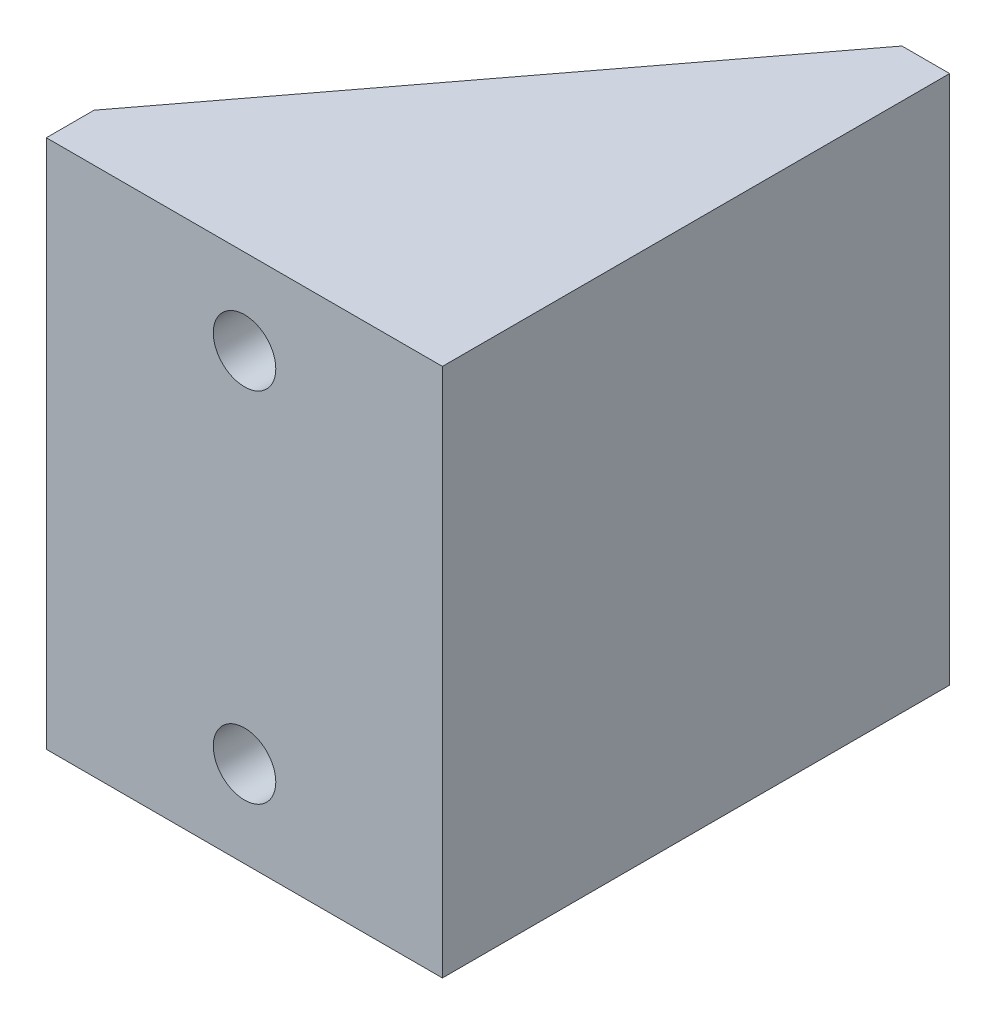
ISO-10303-21;
HEADER;
FILE_DESCRIPTION(('STEP AP214'),'2;1');
FILE_NAME('part.step','',(''),(''),'','','');
FILE_SCHEMA(('AUTOMOTIVE_DESIGN { 1 0 10303 214 1 1 1 1 }'));
ENDSEC;
DATA;
#1=APPLICATION_CONTEXT('core data for automotive mechanical design processes');
#2=APPLICATION_PROTOCOL_DEFINITION('international standard','automotive_design',2000,#1);
#3=PRODUCT_CONTEXT('',#1,'mechanical');
#4=PRODUCT('Part','Part','',(#3));
#5=PRODUCT_RELATED_PRODUCT_CATEGORY('part','',(#4));
#6=PRODUCT_DEFINITION_FORMATION('','',#4);
#7=PRODUCT_DEFINITION_CONTEXT('part definition',#1,'design');
#8=PRODUCT_DEFINITION('design','',#6,#7);
#9=PRODUCT_DEFINITION_SHAPE('','',#8);
#10=(LENGTH_UNIT() NAMED_UNIT(*) SI_UNIT(.MILLI.,.METRE.));
#11=(NAMED_UNIT(*) PLANE_ANGLE_UNIT() SI_UNIT($,.RADIAN.));
#12=(NAMED_UNIT(*) SI_UNIT($,.STERADIAN.) SOLID_ANGLE_UNIT());
#13=UNCERTAINTY_MEASURE_WITH_UNIT(LENGTH_MEASURE(1.E-05),#10,'distance_accuracy_value','');
#14=(GEOMETRIC_REPRESENTATION_CONTEXT(3) GLOBAL_UNCERTAINTY_ASSIGNED_CONTEXT((#13)) GLOBAL_UNIT_ASSIGNED_CONTEXT((#10,
#11,#12)) REPRESENTATION_CONTEXT('',''));
#15=CARTESIAN_POINT('',(0.,0.,0.));
#16=DIRECTION('',(0.,0.,1.));
#17=DIRECTION('',(1.,0.,0.));
#18=AXIS2_PLACEMENT_3D('',#15,#16,#17);
#19=CARTESIAN_POINT('',(21.082,-28.194,5.08));
#20=DIRECTION('',(-1.,0.,0.));
#21=DIRECTION('',(0.,0.,1.));
#22=AXIS2_PLACEMENT_3D('',#19,#20,#21);
#23=PLANE('',#22);
#24=DIRECTION('',(0.,0.,-1.));
#25=VECTOR('',#24,1.);
#26=CARTESIAN_POINT('',(21.082,-28.194,5.08));
#27=LINE('',#26,#25);
#28=CARTESIAN_POINT('',(21.082,-28.194,5.08));
#29=VERTEX_POINT('',#28);
#30=CARTESIAN_POINT('',(21.082,-28.194,-48.92));
#31=VERTEX_POINT('',#30);
#32=EDGE_CURVE('E167',#29,#31,#27,.T.);
#33=ORIENTED_EDGE('',*,*,#32,.T.);
#34=DIRECTION('',(0.,1.,0.));
#35=VECTOR('',#34,1.);
#36=CARTESIAN_POINT('',(21.082,-28.194,-48.92));
#37=LINE('',#36,#35);
#38=CARTESIAN_POINT('',(21.082,28.194,-48.92));
#39=VERTEX_POINT('',#38);
#40=EDGE_CURVE('E147',#31,#39,#37,.T.);
#41=ORIENTED_EDGE('',*,*,#40,.T.);
#42=DIRECTION('',(0.,0.,-1.));
#43=VECTOR('',#42,1.);
#44=CARTESIAN_POINT('',(21.082,28.194,5.08));
#45=LINE('',#44,#43);
#46=CARTESIAN_POINT('',(21.082,28.194,5.08));
#47=VERTEX_POINT('',#46);
#48=EDGE_CURVE('E39',#47,#39,#45,.T.);
#49=ORIENTED_EDGE('',*,*,#48,.F.);
#50=DIRECTION('',(0.,1.,0.));
#51=VECTOR('',#50,1.);
#52=CARTESIAN_POINT('',(21.082,-28.194,5.08));
#53=LINE('',#52,#51);
#54=EDGE_CURVE('E160',#29,#47,#53,.T.);
#55=ORIENTED_EDGE('',*,*,#54,.F.);
#56=EDGE_LOOP('',(#33,#41,#49,#55));
#57=FACE_BOUND('',#56,.T.);
#58=ADVANCED_FACE('F32',(#57),#23,.F.);
#59=CARTESIAN_POINT('',(-21.082,28.194,5.08));
#60=DIRECTION('',(0.,-1.,0.));
#61=DIRECTION('',(0.,0.,-1.));
#62=AXIS2_PLACEMENT_3D('',#59,#60,#61);
#63=PLANE('',#62);
#64=DIRECTION('',(-0.604099786752198,0.,0.79690868212484));
#65=VECTOR('',#64,1.);
#66=CARTESIAN_POINT('',(16.002,28.194,-48.92));
#67=LINE('',#66,#65);
#68=CARTESIAN_POINT('',(16.002,28.194,-48.92));
#69=VERTEX_POINT('',#68);
#70=CARTESIAN_POINT('',(-21.082,28.194,0.));
#71=VERTEX_POINT('',#70);
#72=EDGE_CURVE('E134',#69,#71,#67,.T.);
#73=ORIENTED_EDGE('',*,*,#72,.T.);
#74=DIRECTION('',(0.,0.,-1.));
#75=VECTOR('',#74,1.);
#76=CARTESIAN_POINT('',(-21.082,28.194,5.08));
#77=LINE('',#76,#75);
#78=CARTESIAN_POINT('',(-21.082,28.194,5.08));
#79=VERTEX_POINT('',#78);
#80=EDGE_CURVE('E173',#79,#71,#77,.T.);
#81=ORIENTED_EDGE('',*,*,#80,.F.);
#82=DIRECTION('',(-1.,0.,0.));
#83=VECTOR('',#82,1.);
#84=CARTESIAN_POINT('',(-21.082,28.194,5.08));
#85=LINE('',#84,#83);
#86=EDGE_CURVE('E162',#47,#79,#85,.T.);
#87=ORIENTED_EDGE('',*,*,#86,.F.);
#88=ORIENTED_EDGE('',*,*,#48,.T.);
#89=DIRECTION('',(1.,0.,0.));
#90=VECTOR('',#89,1.);
#91=CARTESIAN_POINT('',(16.002,28.194,-48.92));
#92=LINE('',#91,#90);
#93=EDGE_CURVE('E155',#69,#39,#92,.T.);
#94=ORIENTED_EDGE('',*,*,#93,.F.);
#95=EDGE_LOOP('',(#73,#81,#87,#88,#94));
#96=FACE_BOUND('',#95,.T.);
#97=ADVANCED_FACE('F178',(#96),#63,.F.);
#98=CARTESIAN_POINT('',(-21.082,-28.194,5.08));
#99=DIRECTION('',(1.,0.,0.));
#100=DIRECTION('',(0.,0.,-1.));
#101=AXIS2_PLACEMENT_3D('',#98,#99,#100);
#102=PLANE('',#101);
#103=DIRECTION('',(0.,-1.,0.));
#104=VECTOR('',#103,1.);
#105=CARTESIAN_POINT('',(-21.082,-28.194,0.));
#106=LINE('',#105,#104);
#107=CARTESIAN_POINT('',(-21.082,23.114,0.));
#108=VERTEX_POINT('',#107);
#109=EDGE_CURVE('E163',#71,#108,#106,.T.);
#110=ORIENTED_EDGE('',*,*,#109,.T.);
#111=CARTESIAN_POINT('',(-21.082,-23.114,0.));
#112=VERTEX_POINT('',#111);
#113=EDGE_CURVE('E120',#108,#112,#106,.T.);
#114=ORIENTED_EDGE('',*,*,#113,.T.);
#115=DIRECTION('',(0.,-1.,0.));
#116=VECTOR('',#115,1.);
#117=CARTESIAN_POINT('',(-21.082,-23.114,0.));
#118=LINE('',#117,#116);
#119=CARTESIAN_POINT('',(-21.082,-28.194,0.));
#120=VERTEX_POINT('',#119);
#121=EDGE_CURVE('E136',#112,#120,#118,.T.);
#122=ORIENTED_EDGE('',*,*,#121,.T.);
#123=DIRECTION('',(0.,0.,-1.));
#124=VECTOR('',#123,1.);
#125=CARTESIAN_POINT('',(-21.082,-28.194,5.08));
#126=LINE('',#125,#124);
#127=CARTESIAN_POINT('',(-21.082,-28.194,5.08));
#128=VERTEX_POINT('',#127);
#129=EDGE_CURVE('E170',#128,#120,#126,.T.);
#130=ORIENTED_EDGE('',*,*,#129,.F.);
#131=DIRECTION('',(0.,-1.,0.));
#132=VECTOR('',#131,1.);
#133=CARTESIAN_POINT('',(-21.082,-28.194,5.08));
#134=LINE('',#133,#132);
#135=EDGE_CURVE('E51',#79,#128,#134,.T.);
#136=ORIENTED_EDGE('',*,*,#135,.F.);
#137=ORIENTED_EDGE('',*,*,#80,.T.);
#138=EDGE_LOOP('',(#110,#114,#122,#130,#136,#137));
#139=FACE_BOUND('',#138,.T.);
#140=ADVANCED_FACE('F200',(#139),#102,.F.);
#141=CARTESIAN_POINT('',(-21.082,-28.194,5.08));
#142=DIRECTION('',(0.,1.,0.));
#143=DIRECTION('',(0.,0.,1.));
#144=AXIS2_PLACEMENT_3D('',#141,#142,#143);
#145=PLANE('',#144);
#146=ORIENTED_EDGE('',*,*,#129,.T.);
#147=DIRECTION('',(-0.604099786752198,0.,0.79690868212484));
#148=VECTOR('',#147,1.);
#149=CARTESIAN_POINT('',(16.002,-28.194,-48.92));
#150=LINE('',#149,#148);
#151=CARTESIAN_POINT('',(16.002,-28.194,-48.92));
#152=VERTEX_POINT('',#151);
#153=EDGE_CURVE('E113',#152,#120,#150,.T.);
#154=ORIENTED_EDGE('',*,*,#153,.F.);
#155=DIRECTION('',(1.,0.,0.));
#156=VECTOR('',#155,1.);
#157=CARTESIAN_POINT('',(16.002,-28.194,-48.92));
#158=LINE('',#157,#156);
#159=EDGE_CURVE('E152',#152,#31,#158,.T.);
#160=ORIENTED_EDGE('',*,*,#159,.T.);
#161=ORIENTED_EDGE('',*,*,#32,.F.);
#162=DIRECTION('',(1.,0.,0.));
#163=VECTOR('',#162,1.);
#164=CARTESIAN_POINT('',(-21.082,-28.194,5.08));
#165=LINE('',#164,#163);
#166=EDGE_CURVE('E46',#128,#29,#165,.T.);
#167=ORIENTED_EDGE('',*,*,#166,.F.);
#168=EDGE_LOOP('',(#146,#154,#160,#161,#167));
#169=FACE_BOUND('',#168,.T.);
#170=ADVANCED_FACE('F189',(#169),#145,.F.);
#171=CARTESIAN_POINT('',(0.,0.,5.08));
#172=DIRECTION('',(0.,0.,-1.));
#173=DIRECTION('',(-1.,0.,0.));
#174=AXIS2_PLACEMENT_3D('',#171,#172,#173);
#175=PLANE('',#174);
#176=CARTESIAN_POINT('',(0.0164035310449839,-18.9970964149552,5.08));
#177=DIRECTION('',(0.,0.,1.));
#178=DIRECTION('',(1.,0.,0.));
#179=AXIS2_PLACEMENT_3D('',#176,#177,#178);
#180=CIRCLE('',#179,3.3274);
#181=CARTESIAN_POINT('',(3.34380353104499,-18.9970964149552,5.08));
#182=VERTEX_POINT('',#181);
#183=EDGE_CURVE('E128',#182,#182,#180,.T.);
#184=ORIENTED_EDGE('',*,*,#183,.F.);
#185=EDGE_LOOP('',(#184));
#186=FACE_BOUND('',#185,.T.);
#187=CARTESIAN_POINT('',(0.0164035310449284,19.1029035850448,5.08));
#188=DIRECTION('',(0.,0.,1.));
#189=DIRECTION('',(1.,0.,0.));
#190=AXIS2_PLACEMENT_3D('',#187,#188,#189);
#191=CIRCLE('',#190,3.3274);
#192=CARTESIAN_POINT('',(3.34380353104493,19.1029035850448,5.08));
#193=VERTEX_POINT('',#192);
#194=EDGE_CURVE('E141',#193,#193,#191,.T.);
#195=ORIENTED_EDGE('',*,*,#194,.F.);
#196=EDGE_LOOP('',(#195));
#197=FACE_BOUND('',#196,.T.);
#198=ORIENTED_EDGE('',*,*,#166,.T.);
#199=ORIENTED_EDGE('',*,*,#54,.T.);
#200=ORIENTED_EDGE('',*,*,#86,.T.);
#201=ORIENTED_EDGE('',*,*,#135,.T.);
#202=EDGE_LOOP('',(#198,#199,#200,#201));
#203=FACE_BOUND('',#202,.T.);
#204=ADVANCED_FACE('F207',(#186,#197,#203),#175,.F.);
#205=CARTESIAN_POINT('',(0.,0.,0.));
#206=DIRECTION('',(0.,0.,-1.));
#207=DIRECTION('',(-1.,0.,0.));
#208=AXIS2_PLACEMENT_3D('',#205,#206,#207);
#209=PLANE('',#208);
#210=DIRECTION('',(1.,0.,0.));
#211=VECTOR('',#210,1.);
#212=CARTESIAN_POINT('',(16.002,-23.114,0.));
#213=LINE('',#212,#211);
#214=CARTESIAN_POINT('',(16.002,-23.114,0.));
#215=VERTEX_POINT('',#214);
#216=EDGE_CURVE('E95',#112,#215,#213,.T.);
#217=ORIENTED_EDGE('',*,*,#216,.F.);
#218=ORIENTED_EDGE('',*,*,#113,.F.);
#219=DIRECTION('',(1.,0.,0.));
#220=VECTOR('',#219,1.);
#221=CARTESIAN_POINT('',(16.002,23.114,0.));
#222=LINE('',#221,#220);
#223=CARTESIAN_POINT('',(16.002,23.114,0.));
#224=VERTEX_POINT('',#223);
#225=EDGE_CURVE('E119',#108,#224,#222,.T.);
#226=ORIENTED_EDGE('',*,*,#225,.T.);
#227=DIRECTION('',(0.,1.,0.));
#228=VECTOR('',#227,1.);
#229=CARTESIAN_POINT('',(16.002,0.,0.));
#230=LINE('',#229,#228);
#231=EDGE_CURVE('E11',#215,#224,#230,.T.);
#232=ORIENTED_EDGE('',*,*,#231,.F.);
#233=EDGE_LOOP('',(#217,#218,#226,#232));
#234=FACE_BOUND('',#233,.T.);
#235=CARTESIAN_POINT('',(0.0164035310449839,-18.9970964149552,0.));
#236=DIRECTION('',(0.,0.,1.));
#237=DIRECTION('',(1.,0.,0.));
#238=AXIS2_PLACEMENT_3D('',#235,#236,#237);
#239=CIRCLE('',#238,3.3274);
#240=CARTESIAN_POINT('',(3.34380353104499,-18.9970964149552,0.));
#241=VERTEX_POINT('',#240);
#242=EDGE_CURVE('E138',#241,#241,#239,.T.);
#243=ORIENTED_EDGE('',*,*,#242,.T.);
#244=EDGE_LOOP('',(#243));
#245=FACE_BOUND('',#244,.T.);
#246=CARTESIAN_POINT('',(0.0164035310449284,19.1029035850448,0.));
#247=DIRECTION('',(0.,0.,1.));
#248=DIRECTION('',(1.,0.,0.));
#249=AXIS2_PLACEMENT_3D('',#246,#247,#248);
#250=CIRCLE('',#249,3.3274);
#251=CARTESIAN_POINT('',(3.34380353104493,19.1029035850448,0.));
#252=VERTEX_POINT('',#251);
#253=EDGE_CURVE('E144',#252,#252,#250,.T.);
#254=ORIENTED_EDGE('',*,*,#253,.T.);
#255=EDGE_LOOP('',(#254));
#256=FACE_BOUND('',#255,.T.);
#257=ADVANCED_FACE('F116',(#234,#245,#256),#209,.T.);
#258=CARTESIAN_POINT('',(16.002,-28.194,-48.92));
#259=DIRECTION('',(0.,0.,-1.));
#260=DIRECTION('',(-1.,0.,0.));
#261=AXIS2_PLACEMENT_3D('',#258,#259,#260);
#262=PLANE('',#261);
#263=ORIENTED_EDGE('',*,*,#40,.F.);
#264=ORIENTED_EDGE('',*,*,#159,.F.);
#265=DIRECTION('',(0.,1.,0.));
#266=VECTOR('',#265,1.);
#267=CARTESIAN_POINT('',(16.002,-28.194,-48.92));
#268=LINE('',#267,#266);
#269=CARTESIAN_POINT('',(16.002,-23.114,-48.92));
#270=VERTEX_POINT('',#269);
#271=EDGE_CURVE('E150',#152,#270,#268,.T.);
#272=ORIENTED_EDGE('',*,*,#271,.T.);
#273=CARTESIAN_POINT('',(16.002,23.114,-48.92));
#274=VERTEX_POINT('',#273);
#275=EDGE_CURVE('E111',#270,#274,#268,.T.);
#276=ORIENTED_EDGE('',*,*,#275,.T.);
#277=DIRECTION('',(0.,1.,0.));
#278=VECTOR('',#277,1.);
#279=CARTESIAN_POINT('',(16.002,23.114,-48.92));
#280=LINE('',#279,#278);
#281=EDGE_CURVE('E124',#274,#69,#280,.T.);
#282=ORIENTED_EDGE('',*,*,#281,.T.);
#283=ORIENTED_EDGE('',*,*,#93,.T.);
#284=EDGE_LOOP('',(#263,#264,#272,#276,#282,#283));
#285=FACE_BOUND('',#284,.T.);
#286=ADVANCED_FACE('F184',(#285),#262,.T.);
#287=CARTESIAN_POINT('',(16.002,0.,0.));
#288=DIRECTION('',(-1.,0.,0.));
#289=DIRECTION('',(0.,0.,1.));
#290=AXIS2_PLACEMENT_3D('',#287,#288,#289);
#291=PLANE('',#290);
#292=DIRECTION('',(0.,0.,-1.));
#293=VECTOR('',#292,1.);
#294=CARTESIAN_POINT('',(16.002,-23.114,-48.92));
#295=LINE('',#294,#293);
#296=EDGE_CURVE('E98',#215,#270,#295,.T.);
#297=ORIENTED_EDGE('',*,*,#296,.F.);
#298=ORIENTED_EDGE('',*,*,#231,.T.);
#299=DIRECTION('',(0.,0.,-1.));
#300=VECTOR('',#299,1.);
#301=CARTESIAN_POINT('',(16.002,23.114,-48.92));
#302=LINE('',#301,#300);
#303=EDGE_CURVE('E130',#224,#274,#302,.T.);
#304=ORIENTED_EDGE('',*,*,#303,.T.);
#305=ORIENTED_EDGE('',*,*,#275,.F.);
#306=EDGE_LOOP('',(#297,#298,#304,#305));
#307=FACE_BOUND('',#306,.T.);
#308=ADVANCED_FACE('F108',(#307),#291,.T.);
#309=CARTESIAN_POINT('',(0.0164035310449284,19.1029035850448,0.));
#310=DIRECTION('',(0.,0.,1.));
#311=DIRECTION('',(1.,0.,0.));
#312=AXIS2_PLACEMENT_3D('',#309,#310,#311);
#313=CYLINDRICAL_SURFACE('',#312,3.3274);
#314=ORIENTED_EDGE('',*,*,#253,.F.);
#315=EDGE_LOOP('',(#314));
#316=FACE_BOUND('',#315,.T.);
#317=ORIENTED_EDGE('',*,*,#194,.T.);
#318=EDGE_LOOP('',(#317));
#319=FACE_BOUND('',#318,.T.);
#320=ADVANCED_FACE('F282',(#316,#319),#313,.F.);
#321=CARTESIAN_POINT('',(0.0164035310449839,-18.9970964149552,0.));
#322=DIRECTION('',(0.,0.,1.));
#323=DIRECTION('',(1.,0.,0.));
#324=AXIS2_PLACEMENT_3D('',#321,#322,#323);
#325=CYLINDRICAL_SURFACE('',#324,3.3274);
#326=ORIENTED_EDGE('',*,*,#242,.F.);
#327=EDGE_LOOP('',(#326));
#328=FACE_BOUND('',#327,.T.);
#329=ORIENTED_EDGE('',*,*,#183,.T.);
#330=EDGE_LOOP('',(#329));
#331=FACE_BOUND('',#330,.T.);
#332=ADVANCED_FACE('F226',(#328,#331),#325,.F.);
#333=CARTESIAN_POINT('',(16.002,23.114,-48.92));
#334=DIRECTION('',(-0.79690868212484,0.,-0.604099786752198));
#335=DIRECTION('',(-0.604099786752198,0.,0.79690868212484));
#336=AXIS2_PLACEMENT_3D('',#333,#334,#335);
#337=PLANE('',#336);
#338=ORIENTED_EDGE('',*,*,#72,.F.);
#339=ORIENTED_EDGE('',*,*,#281,.F.);
#340=DIRECTION('',(-0.604099786752198,0.,0.79690868212484));
#341=VECTOR('',#340,1.);
#342=CARTESIAN_POINT('',(16.002,23.114,-48.92));
#343=LINE('',#342,#341);
#344=EDGE_CURVE('E125',#274,#108,#343,.T.);
#345=ORIENTED_EDGE('',*,*,#344,.T.);
#346=ORIENTED_EDGE('',*,*,#109,.F.);
#347=EDGE_LOOP('',(#338,#339,#345,#346));
#348=FACE_BOUND('',#347,.T.);
#349=ADVANCED_FACE('F198',(#348),#337,.T.);
#350=CARTESIAN_POINT('',(0.,23.114,0.));
#351=DIRECTION('',(0.,-1.,0.));
#352=DIRECTION('',(0.,0.,-1.));
#353=AXIS2_PLACEMENT_3D('',#350,#351,#352);
#354=PLANE('',#353);
#355=ORIENTED_EDGE('',*,*,#303,.F.);
#356=ORIENTED_EDGE('',*,*,#225,.F.);
#357=ORIENTED_EDGE('',*,*,#344,.F.);
#358=EDGE_LOOP('',(#355,#356,#357));
#359=FACE_BOUND('',#358,.T.);
#360=ADVANCED_FACE('F196',(#359),#354,.T.);
#361=CARTESIAN_POINT('',(16.002,-23.114,-48.92));
#362=DIRECTION('',(0.79690868212484,0.,0.604099786752198));
#363=DIRECTION('',(0.604099786752198,0.,-0.79690868212484));
#364=AXIS2_PLACEMENT_3D('',#361,#362,#363);
#365=PLANE('',#364);
#366=ORIENTED_EDGE('',*,*,#153,.T.);
#367=ORIENTED_EDGE('',*,*,#121,.F.);
#368=DIRECTION('',(-0.604099786752198,0.,0.79690868212484));
#369=VECTOR('',#368,1.);
#370=CARTESIAN_POINT('',(16.002,-23.114,-48.92));
#371=LINE('',#370,#369);
#372=EDGE_CURVE('E100',#270,#112,#371,.T.);
#373=ORIENTED_EDGE('',*,*,#372,.F.);
#374=ORIENTED_EDGE('',*,*,#271,.F.);
#375=EDGE_LOOP('',(#366,#367,#373,#374));
#376=FACE_BOUND('',#375,.T.);
#377=ADVANCED_FACE('F191',(#376),#365,.F.);
#378=CARTESIAN_POINT('',(0.,-23.114,0.));
#379=DIRECTION('',(0.,1.,0.));
#380=DIRECTION('',(0.,0.,-1.));
#381=AXIS2_PLACEMENT_3D('',#378,#379,#380);
#382=PLANE('',#381);
#383=ORIENTED_EDGE('',*,*,#296,.T.);
#384=ORIENTED_EDGE('',*,*,#372,.T.);
#385=ORIENTED_EDGE('',*,*,#216,.T.);
#386=EDGE_LOOP('',(#383,#384,#385));
#387=FACE_BOUND('',#386,.T.);
#388=ADVANCED_FACE('F97',(#387),#382,.T.);
#389=CLOSED_SHELL('',(#58,#97,#140,#170,#204,#257,#286,#308,#320,#332,#349,#360,#377,#388));
#390=MANIFOLD_SOLID_BREP('B2',#389);
#391=ADVANCED_BREP_SHAPE_REPRESENTATION('',(#18,#390),#14);
#392=SHAPE_DEFINITION_REPRESENTATION(#9,#391);
ENDSEC;
END-ISO-10303-21;
